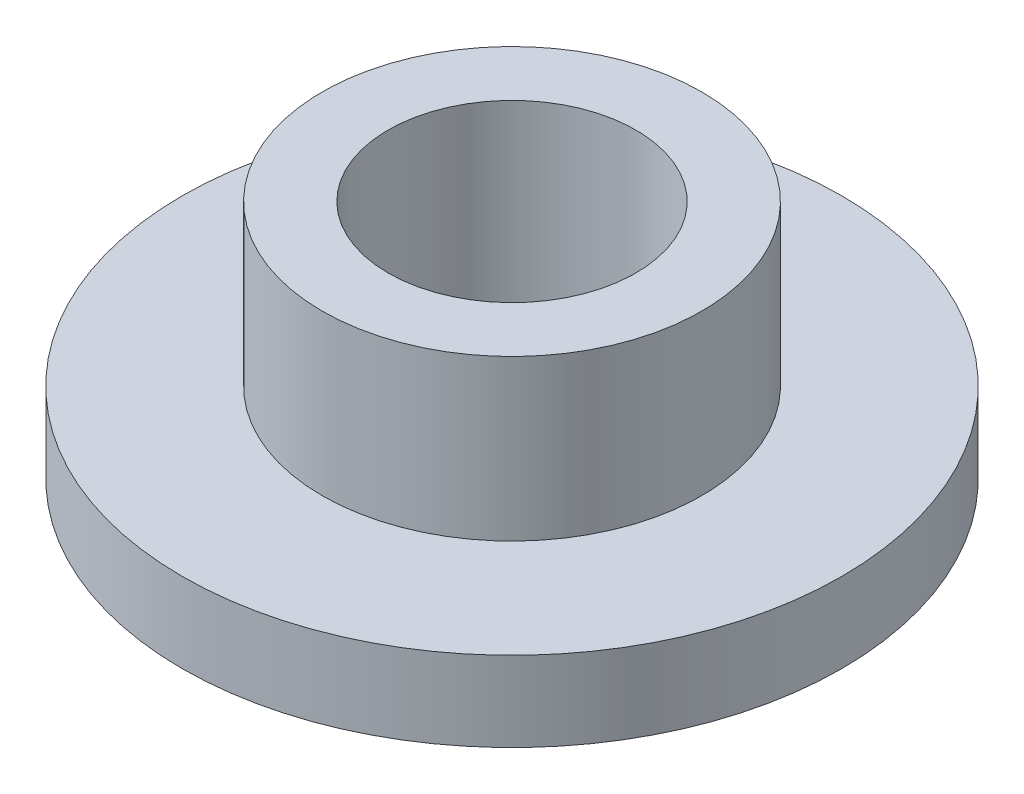
ISO-10303-21;
HEADER;
FILE_DESCRIPTION(('STEP AP214'),'2;1');
FILE_NAME('part.step','',(''),(''),'','','');
FILE_SCHEMA(('AUTOMOTIVE_DESIGN { 1 0 10303 214 1 1 1 1 }'));
ENDSEC;
DATA;
#1=APPLICATION_CONTEXT('core data for automotive mechanical design processes');
#2=APPLICATION_PROTOCOL_DEFINITION('international standard','automotive_design',2000,#1);
#3=PRODUCT_CONTEXT('',#1,'mechanical');
#4=PRODUCT('Part','Part','',(#3));
#5=PRODUCT_RELATED_PRODUCT_CATEGORY('part','',(#4));
#6=PRODUCT_DEFINITION_FORMATION('','',#4);
#7=PRODUCT_DEFINITION_CONTEXT('part definition',#1,'design');
#8=PRODUCT_DEFINITION('design','',#6,#7);
#9=PRODUCT_DEFINITION_SHAPE('','',#8);
#10=(LENGTH_UNIT() NAMED_UNIT(*) SI_UNIT(.MILLI.,.METRE.));
#11=(NAMED_UNIT(*) PLANE_ANGLE_UNIT() SI_UNIT($,.RADIAN.));
#12=(NAMED_UNIT(*) SI_UNIT($,.STERADIAN.) SOLID_ANGLE_UNIT());
#13=UNCERTAINTY_MEASURE_WITH_UNIT(LENGTH_MEASURE(1.E-05),#10,'distance_accuracy_value','');
#14=(GEOMETRIC_REPRESENTATION_CONTEXT(3) GLOBAL_UNCERTAINTY_ASSIGNED_CONTEXT((#13)) GLOBAL_UNIT_ASSIGNED_CONTEXT((#10,
#11,#12)) REPRESENTATION_CONTEXT('',''));
#15=CARTESIAN_POINT('',(0.,0.,0.));
#16=DIRECTION('',(0.,0.,1.));
#17=DIRECTION('',(1.,0.,0.));
#18=AXIS2_PLACEMENT_3D('',#15,#16,#17);
#19=CARTESIAN_POINT('',(40.8918386500941,-57.6371426298124,12.3941404510613));
#20=DIRECTION('',(0.,-1.,0.));
#21=DIRECTION('',(0.,0.,-1.));
#22=AXIS2_PLACEMENT_3D('',#19,#20,#21);
#23=PLANE('',#22);
#24=CARTESIAN_POINT('',(36.8577939001171,-57.6371426298124,10.4000283791901));
#25=DIRECTION('',(0.,1.,0.));
#26=DIRECTION('',(0.,0.,1.));
#27=AXIS2_PLACEMENT_3D('',#24,#25,#26);
#28=CIRCLE('',#27,3.1);
#29=CARTESIAN_POINT('',(36.8577939001171,-57.6371426298124,13.5000283791901));
#30=VERTEX_POINT('',#29);
#31=EDGE_CURVE('E42',#30,#30,#28,.T.);
#32=ORIENTED_EDGE('',*,*,#31,.F.);
#33=EDGE_LOOP('',(#32));
#34=FACE_BOUND('',#33,.T.);
#35=CARTESIAN_POINT('',(36.857793900117,-57.6371426298124,10.4000283791901));
#36=DIRECTION('',(0.,1.,0.));
#37=DIRECTION('',(0.,0.,1.));
#38=AXIS2_PLACEMENT_3D('',#35,#36,#37);
#39=CIRCLE('',#38,4.75);
#40=CARTESIAN_POINT('',(36.857793900117,-57.6371426298124,15.1500283791901));
#41=VERTEX_POINT('',#40);
#42=EDGE_CURVE('E45',#41,#41,#39,.T.);
#43=ORIENTED_EDGE('',*,*,#42,.T.);
#44=EDGE_LOOP('',(#43));
#45=FACE_BOUND('',#44,.T.);
#46=ADVANCED_FACE('F30',(#34,#45),#23,.F.);
#47=CARTESIAN_POINT('',(44.2535426084084,-61.6371426298124,14.0559005109539));
#48=DIRECTION('',(0.,-1.,0.));
#49=DIRECTION('',(0.,0.,-1.));
#50=AXIS2_PLACEMENT_3D('',#47,#48,#49);
#51=PLANE('',#50);
#52=CARTESIAN_POINT('',(36.857793900117,-61.6371426298124,10.4000283791901));
#53=DIRECTION('',(0.,-1.,0.));
#54=DIRECTION('',(0.,0.,-1.));
#55=AXIS2_PLACEMENT_3D('',#52,#53,#54);
#56=CIRCLE('',#55,4.75);
#57=CARTESIAN_POINT('',(36.857793900117,-61.6371426298124,5.65002837919011));
#58=VERTEX_POINT('',#57);
#59=EDGE_CURVE('E48',#58,#58,#56,.F.);
#60=ORIENTED_EDGE('',*,*,#59,.F.);
#61=EDGE_LOOP('',(#60));
#62=FACE_BOUND('',#61,.T.);
#63=CARTESIAN_POINT('',(36.8577939001171,-61.6371426298124,10.4000283791901));
#64=DIRECTION('',(0.,1.,0.));
#65=DIRECTION('',(0.,0.,1.));
#66=AXIS2_PLACEMENT_3D('',#63,#64,#65);
#67=CIRCLE('',#66,8.25);
#68=CARTESIAN_POINT('',(36.8577939001171,-61.6371426298124,18.6500283791901));
#69=VERTEX_POINT('',#68);
#70=EDGE_CURVE('E33',#69,#69,#67,.F.);
#71=ORIENTED_EDGE('',*,*,#70,.F.);
#72=EDGE_LOOP('',(#71));
#73=FACE_BOUND('',#72,.T.);
#74=ADVANCED_FACE('F62',(#62,#73),#51,.F.);
#75=CARTESIAN_POINT('',(36.857793900117,6.19574146722269,10.4000283791901));
#76=DIRECTION('',(0.,1.,0.));
#77=DIRECTION('',(0.,0.,1.));
#78=AXIS2_PLACEMENT_3D('',#75,#76,#77);
#79=CYLINDRICAL_SURFACE('',#78,8.25);
#80=ORIENTED_EDGE('',*,*,#70,.T.);
#81=EDGE_LOOP('',(#80));
#82=FACE_BOUND('',#81,.T.);
#83=CARTESIAN_POINT('',(36.8577939001171,-63.6371426298124,10.4000283791901));
#84=DIRECTION('',(0.,1.,0.));
#85=DIRECTION('',(0.,0.,1.));
#86=AXIS2_PLACEMENT_3D('',#83,#84,#85);
#87=CIRCLE('',#86,8.25);
#88=CARTESIAN_POINT('',(36.8577939001171,-63.6371426298124,18.6500283791901));
#89=VERTEX_POINT('',#88);
#90=EDGE_CURVE('E10',#89,#89,#87,.T.);
#91=ORIENTED_EDGE('',*,*,#90,.T.);
#92=EDGE_LOOP('',(#91));
#93=FACE_BOUND('',#92,.T.);
#94=ADVANCED_FACE('F65',(#82,#93),#79,.T.);
#95=CARTESIAN_POINT('',(44.2535426084084,-63.6371426298124,14.0559005109539));
#96=DIRECTION('',(0.,1.,0.));
#97=DIRECTION('',(0.,0.,1.));
#98=AXIS2_PLACEMENT_3D('',#95,#96,#97);
#99=PLANE('',#98);
#100=CARTESIAN_POINT('',(36.8577939001171,-63.6371426298124,10.4000283791901));
#101=DIRECTION('',(0.,1.,0.));
#102=DIRECTION('',(0.,0.,1.));
#103=AXIS2_PLACEMENT_3D('',#100,#101,#102);
#104=CIRCLE('',#103,3.1);
#105=CARTESIAN_POINT('',(36.8577939001171,-63.6371426298124,13.5000283791901));
#106=VERTEX_POINT('',#105);
#107=EDGE_CURVE('E40',#106,#106,#104,.T.);
#108=ORIENTED_EDGE('',*,*,#107,.T.);
#109=EDGE_LOOP('',(#108));
#110=FACE_BOUND('',#109,.T.);
#111=ORIENTED_EDGE('',*,*,#90,.F.);
#112=EDGE_LOOP('',(#111));
#113=FACE_BOUND('',#112,.T.);
#114=ADVANCED_FACE('F69',(#110,#113),#99,.F.);
#115=CARTESIAN_POINT('',(36.8577939001171,-63.6371426298124,10.4000283791901));
#116=DIRECTION('',(0.,1.,0.));
#117=DIRECTION('',(0.,0.,1.));
#118=AXIS2_PLACEMENT_3D('',#115,#116,#117);
#119=CYLINDRICAL_SURFACE('',#118,3.1);
#120=CARTESIAN_POINT('',(36.8577939001171,-63.6371426298124,13.5000283791901));
#121=CARTESIAN_POINT('',(36.8577939001171,-63.5746426298124,13.5000283791901));
#122=CARTESIAN_POINT('',(36.8577939001171,-63.5121426298124,13.5000283791901));
#123=CARTESIAN_POINT('',(36.8577939001171,-63.3871426298124,13.5000283791901));
#124=CARTESIAN_POINT('',(36.8577939001171,-63.3246426298124,13.5000283791901));
#125=CARTESIAN_POINT('',(36.8577939001171,-63.1996426298124,13.5000283791901));
#126=CARTESIAN_POINT('',(36.8577939001171,-63.1371426298124,13.5000283791901));
#127=CARTESIAN_POINT('',(36.8577939001171,-63.0121426298124,13.5000283791901));
#128=CARTESIAN_POINT('',(36.8577939001171,-62.9496426298124,13.5000283791901));
#129=CARTESIAN_POINT('',(36.8577939001171,-62.8246426298124,13.5000283791901));
#130=CARTESIAN_POINT('',(36.8577939001171,-62.7621426298124,13.5000283791901));
#131=CARTESIAN_POINT('',(36.8577939001171,-62.6371426298124,13.5000283791901));
#132=CARTESIAN_POINT('',(36.8577939001171,-62.5746426298124,13.5000283791901));
#133=CARTESIAN_POINT('',(36.8577939001171,-62.4496426298124,13.5000283791901));
#134=CARTESIAN_POINT('',(36.8577939001171,-62.3871426298124,13.5000283791901));
#135=CARTESIAN_POINT('',(36.8577939001171,-62.2621426298124,13.5000283791901));
#136=CARTESIAN_POINT('',(36.8577939001171,-62.1996426298124,13.5000283791901));
#137=CARTESIAN_POINT('',(36.8577939001171,-62.0746426298124,13.5000283791901));
#138=CARTESIAN_POINT('',(36.8577939001171,-62.0121426298124,13.5000283791901));
#139=CARTESIAN_POINT('',(36.8577939001171,-61.8871426298124,13.5000283791901));
#140=CARTESIAN_POINT('',(36.8577939001171,-61.8246426298124,13.5000283791901));
#141=CARTESIAN_POINT('',(36.8577939001171,-61.6996426298124,13.5000283791901));
#142=CARTESIAN_POINT('',(36.8577939001171,-61.6371426298124,13.5000283791901));
#143=CARTESIAN_POINT('',(36.8577939001171,-61.5121426298124,13.5000283791901));
#144=CARTESIAN_POINT('',(36.8577939001171,-61.4496426298124,13.5000283791901));
#145=CARTESIAN_POINT('',(36.8577939001171,-61.3246426298124,13.5000283791901));
#146=CARTESIAN_POINT('',(36.8577939001171,-61.2621426298124,13.5000283791901));
#147=CARTESIAN_POINT('',(36.8577939001171,-61.1371426298124,13.5000283791901));
#148=CARTESIAN_POINT('',(36.8577939001171,-61.0746426298124,13.5000283791901));
#149=CARTESIAN_POINT('',(36.8577939001171,-60.9496426298124,13.5000283791901));
#150=CARTESIAN_POINT('',(36.8577939001171,-60.8871426298124,13.5000283791901));
#151=CARTESIAN_POINT('',(36.8577939001171,-60.7621426298124,13.5000283791901));
#152=CARTESIAN_POINT('',(36.8577939001171,-60.6996426298124,13.5000283791901));
#153=CARTESIAN_POINT('',(36.8577939001171,-60.5746426298124,13.5000283791901));
#154=CARTESIAN_POINT('',(36.8577939001171,-60.5121426298124,13.5000283791901));
#155=CARTESIAN_POINT('',(36.8577939001171,-60.3871426298124,13.5000283791901));
#156=CARTESIAN_POINT('',(36.8577939001171,-60.3246426298124,13.5000283791901));
#157=CARTESIAN_POINT('',(36.8577939001171,-60.1996426298124,13.5000283791901));
#158=CARTESIAN_POINT('',(36.8577939001171,-60.1371426298124,13.5000283791901));
#159=CARTESIAN_POINT('',(36.8577939001171,-60.0121426298124,13.5000283791901));
#160=CARTESIAN_POINT('',(36.8577939001171,-59.9496426298124,13.5000283791901));
#161=CARTESIAN_POINT('',(36.8577939001171,-59.8246426298124,13.5000283791901));
#162=CARTESIAN_POINT('',(36.8577939001171,-59.7621426298124,13.5000283791901));
#163=CARTESIAN_POINT('',(36.8577939001171,-59.6371426298124,13.5000283791901));
#164=CARTESIAN_POINT('',(36.8577939001171,-59.5746426298124,13.5000283791901));
#165=CARTESIAN_POINT('',(36.8577939001171,-59.4496426298124,13.5000283791901));
#166=CARTESIAN_POINT('',(36.8577939001171,-59.3871426298124,13.5000283791901));
#167=CARTESIAN_POINT('',(36.8577939001171,-59.2621426298124,13.5000283791901));
#168=CARTESIAN_POINT('',(36.8577939001171,-59.1996426298124,13.5000283791901));
#169=CARTESIAN_POINT('',(36.8577939001171,-59.0746426298124,13.5000283791901));
#170=CARTESIAN_POINT('',(36.8577939001171,-59.0121426298124,13.5000283791901));
#171=CARTESIAN_POINT('',(36.8577939001171,-58.8871426298124,13.5000283791901));
#172=CARTESIAN_POINT('',(36.8577939001171,-58.8246426298124,13.5000283791901));
#173=CARTESIAN_POINT('',(36.8577939001171,-58.6996426298124,13.5000283791901));
#174=CARTESIAN_POINT('',(36.8577939001171,-58.6371426298124,13.5000283791901));
#175=CARTESIAN_POINT('',(36.8577939001171,-58.5121426298124,13.5000283791901));
#176=CARTESIAN_POINT('',(36.8577939001171,-58.4496426298124,13.5000283791901));
#177=CARTESIAN_POINT('',(36.8577939001171,-58.3246426298124,13.5000283791901));
#178=CARTESIAN_POINT('',(36.8577939001171,-58.2621426298124,13.5000283791901));
#179=CARTESIAN_POINT('',(36.8577939001171,-58.1371426298124,13.5000283791901));
#180=CARTESIAN_POINT('',(36.8577939001171,-58.0746426298124,13.5000283791901));
#181=CARTESIAN_POINT('',(36.8577939001171,-57.9496426298124,13.5000283791901));
#182=CARTESIAN_POINT('',(36.8577939001171,-57.8871426298124,13.5000283791901));
#183=CARTESIAN_POINT('',(36.8577939001171,-57.7621426298124,13.5000283791901));
#184=CARTESIAN_POINT('',(36.8577939001171,-57.6996426298124,13.5000283791901));
#185=CARTESIAN_POINT('',(36.8577939001171,-57.6371426298124,13.5000283791901));
#186=B_SPLINE_CURVE_WITH_KNOTS('',3,(#120,#121,#122,#123,#124,#125,#126,#127,#128,#129,#130,
#131,#132,#133,#134,#135,#136,#137,#138,#139,#140,#141,#142,#143,#144,#145,#146,#147,#148,#149,
#150,#151,#152,#153,#154,#155,#156,#157,#158,#159,#160,#161,#162,#163,#164,#165,#166,#167,#168,
#169,#170,#171,#172,#173,#174,#175,#176,#177,#178,#179,#180,#181,#182,#183,#184,#185),
.UNSPECIFIED.,.F.,.F.,(4,2,2,2,2,2,2,2,2,2,2,2,2,2,2,2,2,2,2,2,2,2,2,2,2,2,2,2,2,2,2,2,4),(0.,
0.187500000000007,0.375000000000014,0.562500000000007,0.750000000000015,0.937500000000008,
1.12500000000001,1.31250000000001,1.50000000000001,1.68750000000001,1.87500000000001,
2.06250000000001,2.25000000000001,2.43750000000001,2.62500000000001,2.81250000000001,
3.00000000000001,3.18750000000001,3.37500000000001,3.56250000000001,3.75000000000001,
3.93750000000001,4.12500000000001,4.31250000000001,4.50000000000001,4.68750000000001,
4.87500000000001,5.06250000000001,5.25000000000001,5.43750000000001,5.62500000000001,
5.81250000000001,6.00000000000001),.UNSPECIFIED.);
#187=EDGE_CURVE('BSEAM58',#106,#30,#186,.T.);
#188=ORIENTED_EDGE('',*,*,#107,.F.);
#189=ORIENTED_EDGE('',*,*,#31,.T.);
#190=ORIENTED_EDGE('',*,*,#187,.T.);
#191=ORIENTED_EDGE('',*,*,#187,.F.);
#192=EDGE_LOOP('',(#188,#190,#189,#191));
#193=FACE_BOUND('',#192,.T.);
#194=ADVANCED_FACE('F58',(#193),#119,.F.);
#195=CARTESIAN_POINT('',(36.857793900117,-75.0721714723568,10.4000283791901));
#196=DIRECTION('',(0.,1.,0.));
#197=DIRECTION('',(0.,0.,1.));
#198=AXIS2_PLACEMENT_3D('',#195,#196,#197);
#199=CYLINDRICAL_SURFACE('',#198,4.75);
#200=ORIENTED_EDGE('',*,*,#42,.F.);
#201=EDGE_LOOP('',(#200));
#202=FACE_BOUND('',#201,.T.);
#203=ORIENTED_EDGE('',*,*,#59,.T.);
#204=EDGE_LOOP('',(#203));
#205=FACE_BOUND('',#204,.T.);
#206=ADVANCED_FACE('F55',(#202,#205),#199,.T.);
#207=CLOSED_SHELL('',(#46,#74,#94,#114,#194,#206));
#208=MANIFOLD_SOLID_BREP('B2',#207);
#209=ADVANCED_BREP_SHAPE_REPRESENTATION('',(#18,#208),#14);
#210=SHAPE_DEFINITION_REPRESENTATION(#9,#209);
ENDSEC;
END-ISO-10303-21;
